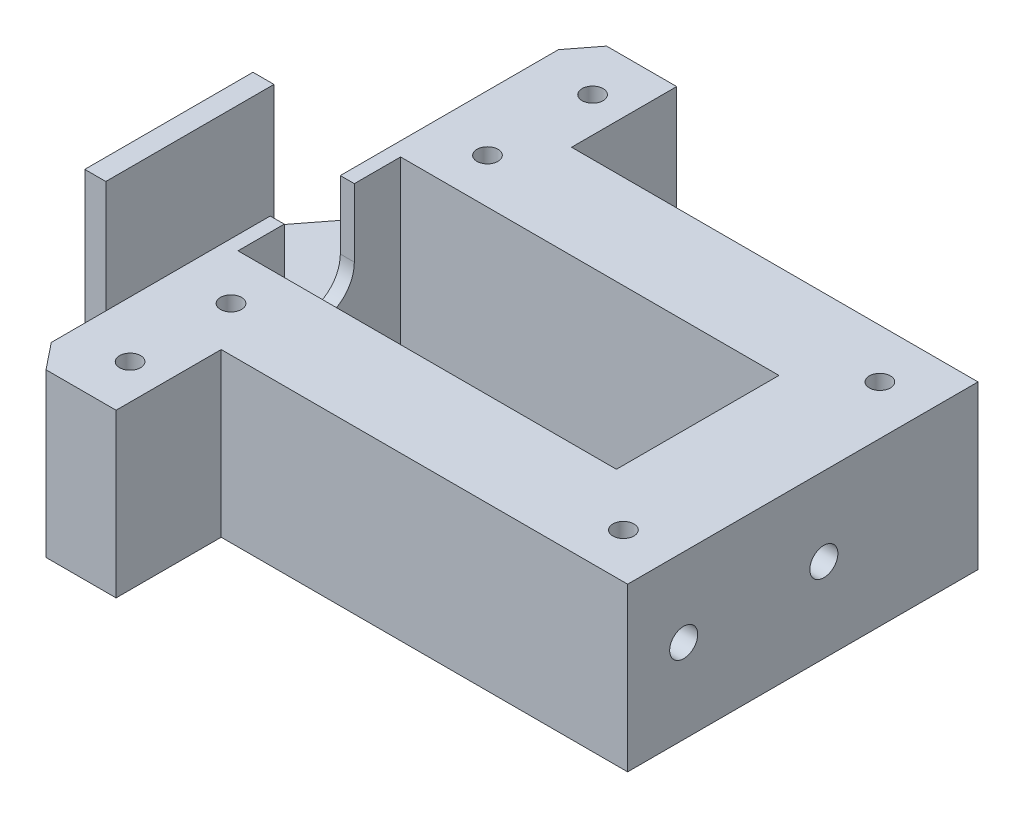
ISO-10303-21;
HEADER;
FILE_DESCRIPTION(('STEP AP214'),'2;1');
FILE_NAME('part.step','',(''),(''),'','','');
FILE_SCHEMA(('AUTOMOTIVE_DESIGN { 1 0 10303 214 1 1 1 1 }'));
ENDSEC;
DATA;
#1=APPLICATION_CONTEXT('core data for automotive mechanical design processes');
#2=APPLICATION_PROTOCOL_DEFINITION('international standard','automotive_design',2000,#1);
#3=PRODUCT_CONTEXT('',#1,'mechanical');
#4=PRODUCT('Part','Part','',(#3));
#5=PRODUCT_RELATED_PRODUCT_CATEGORY('part','',(#4));
#6=PRODUCT_DEFINITION_FORMATION('','',#4);
#7=PRODUCT_DEFINITION_CONTEXT('part definition',#1,'design');
#8=PRODUCT_DEFINITION('design','',#6,#7);
#9=PRODUCT_DEFINITION_SHAPE('','',#8);
#10=(LENGTH_UNIT() NAMED_UNIT(*) SI_UNIT(.MILLI.,.METRE.));
#11=(NAMED_UNIT(*) PLANE_ANGLE_UNIT() SI_UNIT($,.RADIAN.));
#12=(NAMED_UNIT(*) SI_UNIT($,.STERADIAN.) SOLID_ANGLE_UNIT());
#13=UNCERTAINTY_MEASURE_WITH_UNIT(LENGTH_MEASURE(1.E-05),#10,'distance_accuracy_value','');
#14=(GEOMETRIC_REPRESENTATION_CONTEXT(3) GLOBAL_UNCERTAINTY_ASSIGNED_CONTEXT((#13)) GLOBAL_UNIT_ASSIGNED_CONTEXT((#10,
#11,#12)) REPRESENTATION_CONTEXT('',''));
#15=CARTESIAN_POINT('',(0.,0.,0.));
#16=DIRECTION('',(0.,0.,1.));
#17=DIRECTION('',(1.,0.,0.));
#18=AXIS2_PLACEMENT_3D('',#15,#16,#17);
#19=CARTESIAN_POINT('',(0.,11.6,6.23298171670485));
#20=DIRECTION('',(0.781245544254896,0.,-0.624223837723193));
#21=DIRECTION('',(-0.624223837723193,0.,-0.781245544254896));
#22=AXIS2_PLACEMENT_3D('',#19,#20,#21);
#23=PLANE('',#22);
#24=DIRECTION('',(0.624223837723193,0.,0.781245544254896));
#25=VECTOR('',#24,1.);
#26=CARTESIAN_POINT('',(1.5,2.05,8.11030239169965));
#27=LINE('',#26,#25);
#28=CARTESIAN_POINT('',(0.,2.05,6.23298171670485));
#29=VERTEX_POINT('',#28);
#30=CARTESIAN_POINT('',(9.5,2.05,18.1226793250052));
#31=VERTEX_POINT('',#30);
#32=EDGE_CURVE('E274',#29,#31,#27,.T.);
#33=ORIENTED_EDGE('',*,*,#32,.F.);
#34=DIRECTION('',(0.,-1.,0.));
#35=VECTOR('',#34,1.);
#36=CARTESIAN_POINT('',(0.,11.6,6.23298171670485));
#37=LINE('',#36,#35);
#38=CARTESIAN_POINT('',(0.,0.,6.23298171670485));
#39=VERTEX_POINT('',#38);
#40=EDGE_CURVE('E223',#29,#39,#37,.T.);
#41=ORIENTED_EDGE('',*,*,#40,.T.);
#42=DIRECTION('',(0.624223837723193,0.,0.781245544254896));
#43=VECTOR('',#42,1.);
#44=CARTESIAN_POINT('',(0.,0.,6.23298171670485));
#45=LINE('',#44,#43);
#46=CARTESIAN_POINT('',(11.,0.,20.));
#47=VERTEX_POINT('',#46);
#48=EDGE_CURVE('E224',#39,#47,#45,.T.);
#49=ORIENTED_EDGE('',*,*,#48,.T.);
#50=DIRECTION('',(0.,-1.,0.));
#51=VECTOR('',#50,1.);
#52=CARTESIAN_POINT('',(11.,11.6,20.));
#53=LINE('',#52,#51);
#54=CARTESIAN_POINT('',(11.,11.6,20.));
#55=VERTEX_POINT('',#54);
#56=EDGE_CURVE('E11',#55,#47,#53,.T.);
#57=ORIENTED_EDGE('',*,*,#56,.F.);
#58=DIRECTION('',(0.624223837723193,0.,0.781245544254896));
#59=VECTOR('',#58,1.);
#60=CARTESIAN_POINT('',(0.,11.6,6.23298171670485));
#61=LINE('',#60,#59);
#62=CARTESIAN_POINT('',(9.5,11.6,18.1226793250052));
#63=VERTEX_POINT('',#62);
#64=EDGE_CURVE('E242',#63,#55,#61,.T.);
#65=ORIENTED_EDGE('',*,*,#64,.F.);
#66=DIRECTION('',(0.,1.,0.));
#67=VECTOR('',#66,1.);
#68=CARTESIAN_POINT('',(9.5,2.05,18.1226793250052));
#69=LINE('',#68,#67);
#70=EDGE_CURVE('E286',#31,#63,#69,.T.);
#71=ORIENTED_EDGE('',*,*,#70,.F.);
#72=EDGE_LOOP('',(#33,#41,#49,#57,#65,#71));
#73=FACE_BOUND('',#72,.T.);
#74=ADVANCED_FACE('F34',(#73),#23,.F.);
#75=CARTESIAN_POINT('',(11.,11.6,-20.));
#76=DIRECTION('',(0.791236938020187,0.,0.611509695681466));
#77=DIRECTION('',(0.611509695681466,0.,-0.791236938020187));
#78=AXIS2_PLACEMENT_3D('',#75,#76,#77);
#79=PLANE('',#78);
#80=DIRECTION('',(0.,-1.,0.));
#81=VECTOR('',#80,1.);
#82=CARTESIAN_POINT('',(0.,11.6,-5.76701828329514));
#83=LINE('',#82,#81);
#84=CARTESIAN_POINT('',(0.,2.05,-5.76701828329514));
#85=VERTEX_POINT('',#84);
#86=CARTESIAN_POINT('',(0.,0.,-5.76701828329514));
#87=VERTEX_POINT('',#86);
#88=EDGE_CURVE('E246',#85,#87,#83,.T.);
#89=ORIENTED_EDGE('',*,*,#88,.F.);
#90=DIRECTION('',(-0.611509695681466,0.,0.791236938020187));
#91=VECTOR('',#90,1.);
#92=CARTESIAN_POINT('',(9.5,2.05,-18.059138856813));
#93=LINE('',#92,#91);
#94=CARTESIAN_POINT('',(9.5,2.05,-18.059138856813));
#95=VERTEX_POINT('',#94);
#96=EDGE_CURVE('E265',#95,#85,#93,.T.);
#97=ORIENTED_EDGE('',*,*,#96,.F.);
#98=DIRECTION('',(0.,1.,0.));
#99=VECTOR('',#98,1.);
#100=CARTESIAN_POINT('',(9.5,2.05,-18.059138856813));
#101=LINE('',#100,#99);
#102=CARTESIAN_POINT('',(9.5,11.6,-18.059138856813));
#103=VERTEX_POINT('',#102);
#104=EDGE_CURVE('E228',#95,#103,#101,.T.);
#105=ORIENTED_EDGE('',*,*,#104,.T.);
#106=DIRECTION('',(-0.611509695681466,0.,0.791236938020187));
#107=VECTOR('',#106,1.);
#108=CARTESIAN_POINT('',(11.,11.6,-20.));
#109=LINE('',#108,#107);
#110=CARTESIAN_POINT('',(11.,11.6,-20.));
#111=VERTEX_POINT('',#110);
#112=EDGE_CURVE('E212',#111,#103,#109,.T.);
#113=ORIENTED_EDGE('',*,*,#112,.F.);
#114=DIRECTION('',(0.,-1.,0.));
#115=VECTOR('',#114,1.);
#116=CARTESIAN_POINT('',(11.,11.6,-20.));
#117=LINE('',#116,#115);
#118=CARTESIAN_POINT('',(11.,0.,-20.));
#119=VERTEX_POINT('',#118);
#120=EDGE_CURVE('E41',#111,#119,#117,.T.);
#121=ORIENTED_EDGE('',*,*,#120,.T.);
#122=DIRECTION('',(-0.611509695681466,0.,0.791236938020187));
#123=VECTOR('',#122,1.);
#124=CARTESIAN_POINT('',(11.,0.,-20.));
#125=LINE('',#124,#123);
#126=EDGE_CURVE('E236',#119,#87,#125,.T.);
#127=ORIENTED_EDGE('',*,*,#126,.T.);
#128=EDGE_LOOP('',(#89,#97,#105,#113,#121,#127));
#129=FACE_BOUND('',#128,.T.);
#130=ADVANCED_FACE('F252',(#129),#79,.F.);
#131=CARTESIAN_POINT('',(0.,11.6,0.));
#132=DIRECTION('',(0.,-1.,0.));
#133=DIRECTION('',(0.,0.,-1.));
#134=AXIS2_PLACEMENT_3D('',#131,#132,#133);
#135=PLANE('',#134);
#136=CARTESIAN_POINT('',(13.5,11.6,-9.));
#137=DIRECTION('',(0.,1.,0.));
#138=DIRECTION('',(0.,0.,1.));
#139=AXIS2_PLACEMENT_3D('',#136,#137,#138);
#140=CIRCLE('',#139,0.75);
#141=CARTESIAN_POINT('',(13.5,11.6,-8.25));
#142=VERTEX_POINT('',#141);
#143=EDGE_CURVE('E826',#142,#142,#140,.T.);
#144=ORIENTED_EDGE('',*,*,#143,.F.);
#145=EDGE_LOOP('',(#144));
#146=FACE_BOUND('',#145,.T.);
#147=CARTESIAN_POINT('',(41.5,11.6,-9.));
#148=DIRECTION('',(0.,1.,0.));
#149=DIRECTION('',(0.,0.,1.));
#150=AXIS2_PLACEMENT_3D('',#147,#148,#149);
#151=CIRCLE('',#150,0.749999999999999);
#152=CARTESIAN_POINT('',(41.5,11.6,-8.25));
#153=VERTEX_POINT('',#152);
#154=EDGE_CURVE('E832',#153,#153,#151,.T.);
#155=ORIENTED_EDGE('',*,*,#154,.F.);
#156=EDGE_LOOP('',(#155));
#157=FACE_BOUND('',#156,.T.);
#158=CARTESIAN_POINT('',(41.5,11.6,9.3));
#159=DIRECTION('',(0.,1.,0.));
#160=DIRECTION('',(0.,0.,1.));
#161=AXIS2_PLACEMENT_3D('',#158,#159,#160);
#162=CIRCLE('',#161,0.749999999999999);
#163=CARTESIAN_POINT('',(41.5,11.6,10.05));
#164=VERTEX_POINT('',#163);
#165=EDGE_CURVE('E838',#164,#164,#162,.T.);
#166=ORIENTED_EDGE('',*,*,#165,.F.);
#167=EDGE_LOOP('',(#166));
#168=FACE_BOUND('',#167,.T.);
#169=CARTESIAN_POINT('',(13.5,11.6,9.3));
#170=DIRECTION('',(0.,1.,0.));
#171=DIRECTION('',(0.,0.,1.));
#172=AXIS2_PLACEMENT_3D('',#169,#170,#171);
#173=CIRCLE('',#172,0.75);
#174=CARTESIAN_POINT('',(13.5,11.6,10.05));
#175=VERTEX_POINT('',#174);
#176=EDGE_CURVE('E844',#175,#175,#173,.T.);
#177=ORIENTED_EDGE('',*,*,#176,.F.);
#178=EDGE_LOOP('',(#177));
#179=FACE_BOUND('',#178,.T.);
#180=CARTESIAN_POINT('',(13.5,11.6,16.5));
#181=DIRECTION('',(0.,1.,0.));
#182=DIRECTION('',(0.,0.,1.));
#183=AXIS2_PLACEMENT_3D('',#180,#181,#182);
#184=CIRCLE('',#183,0.75);
#185=CARTESIAN_POINT('',(13.5,11.6,17.25));
#186=VERTEX_POINT('',#185);
#187=EDGE_CURVE('E820',#186,#186,#184,.T.);
#188=ORIENTED_EDGE('',*,*,#187,.F.);
#189=EDGE_LOOP('',(#188));
#190=FACE_BOUND('',#189,.T.);
#191=CARTESIAN_POINT('',(13.5,11.6,-16.5));
#192=DIRECTION('',(0.,1.,0.));
#193=DIRECTION('',(0.,0.,1.));
#194=AXIS2_PLACEMENT_3D('',#191,#192,#193);
#195=CIRCLE('',#194,0.75);
#196=CARTESIAN_POINT('',(13.5,11.6,-15.75));
#197=VERTEX_POINT('',#196);
#198=EDGE_CURVE('E825',#197,#197,#195,.T.);
#199=ORIENTED_EDGE('',*,*,#198,.F.);
#200=EDGE_LOOP('',(#199));
#201=FACE_BOUND('',#200,.T.);
#202=DIRECTION('',(-1.,0.,0.));
#203=VECTOR('',#202,1.);
#204=CARTESIAN_POINT('',(16.,11.6,-12.5));
#205=LINE('',#204,#203);
#206=CARTESIAN_POINT('',(45.,11.6,-12.5));
#207=VERTEX_POINT('',#206);
#208=CARTESIAN_POINT('',(16.,11.6,-12.5));
#209=VERTEX_POINT('',#208);
#210=EDGE_CURVE('E199',#207,#209,#205,.T.);
#211=ORIENTED_EDGE('',*,*,#210,.T.);
#212=DIRECTION('',(0.,0.,-1.));
#213=VECTOR('',#212,1.);
#214=CARTESIAN_POINT('',(16.,11.6,-20.));
#215=LINE('',#214,#213);
#216=CARTESIAN_POINT('',(16.,11.6,-20.));
#217=VERTEX_POINT('',#216);
#218=EDGE_CURVE('E192',#209,#217,#215,.T.);
#219=ORIENTED_EDGE('',*,*,#218,.T.);
#220=DIRECTION('',(-1.,0.,0.));
#221=VECTOR('',#220,1.);
#222=CARTESIAN_POINT('',(45.,11.6,-20.));
#223=LINE('',#222,#221);
#224=EDGE_CURVE('E204',#217,#111,#223,.T.);
#225=ORIENTED_EDGE('',*,*,#224,.T.);
#226=ORIENTED_EDGE('',*,*,#112,.T.);
#227=DIRECTION('',(0.,0.,-1.));
#228=VECTOR('',#227,1.);
#229=CARTESIAN_POINT('',(9.5,11.6,18.1226793250052));
#230=LINE('',#229,#228);
#231=CARTESIAN_POINT('',(9.5,11.6,-2.5));
#232=VERTEX_POINT('',#231);
#233=EDGE_CURVE('E277',#232,#103,#230,.T.);
#234=ORIENTED_EDGE('',*,*,#233,.F.);
#235=DIRECTION('',(1.,0.,0.));
#236=VECTOR('',#235,1.);
#237=CARTESIAN_POINT('',(7.5,11.6,-2.5));
#238=LINE('',#237,#236);
#239=CARTESIAN_POINT('',(10.5,11.6,-2.5));
#240=VERTEX_POINT('',#239);
#241=EDGE_CURVE('E344',#232,#240,#238,.T.);
#242=ORIENTED_EDGE('',*,*,#241,.T.);
#243=DIRECTION('',(0.,0.,1.));
#244=VECTOR('',#243,1.);
#245=CARTESIAN_POINT('',(10.5,11.6,-5.8));
#246=LINE('',#245,#244);
#247=CARTESIAN_POINT('',(10.5,11.6,-5.8));
#248=VERTEX_POINT('',#247);
#249=EDGE_CURVE('E373',#248,#240,#246,.T.);
#250=ORIENTED_EDGE('',*,*,#249,.F.);
#251=DIRECTION('',(-1.,0.,0.));
#252=VECTOR('',#251,1.);
#253=CARTESIAN_POINT('',(10.5,11.6,-5.8));
#254=LINE('',#253,#252);
#255=CARTESIAN_POINT('',(37.5,11.6,-5.8));
#256=VERTEX_POINT('',#255);
#257=EDGE_CURVE('E364',#256,#248,#254,.T.);
#258=ORIENTED_EDGE('',*,*,#257,.F.);
#259=DIRECTION('',(0.,0.,-1.));
#260=VECTOR('',#259,1.);
#261=CARTESIAN_POINT('',(37.5,11.6,-5.8));
#262=LINE('',#261,#260);
#263=CARTESIAN_POINT('',(37.5,11.6,5.8));
#264=VERTEX_POINT('',#263);
#265=EDGE_CURVE('E379',#264,#256,#262,.T.);
#266=ORIENTED_EDGE('',*,*,#265,.F.);
#267=DIRECTION('',(1.,0.,0.));
#268=VECTOR('',#267,1.);
#269=CARTESIAN_POINT('',(10.5,11.6,5.8));
#270=LINE('',#269,#268);
#271=CARTESIAN_POINT('',(10.5,11.6,5.8));
#272=VERTEX_POINT('',#271);
#273=EDGE_CURVE('E376',#272,#264,#270,.T.);
#274=ORIENTED_EDGE('',*,*,#273,.F.);
#275=CARTESIAN_POINT('',(10.5,11.6,2.5));
#276=VERTEX_POINT('',#275);
#277=EDGE_CURVE('E359',#276,#272,#246,.T.);
#278=ORIENTED_EDGE('',*,*,#277,.F.);
#279=DIRECTION('',(1.,0.,0.));
#280=VECTOR('',#279,1.);
#281=CARTESIAN_POINT('',(7.5,11.6,2.5));
#282=LINE('',#281,#280);
#283=CARTESIAN_POINT('',(9.5,11.6,2.5));
#284=VERTEX_POINT('',#283);
#285=EDGE_CURVE('E341',#284,#276,#282,.T.);
#286=ORIENTED_EDGE('',*,*,#285,.F.);
#287=EDGE_CURVE('E271',#63,#284,#230,.T.);
#288=ORIENTED_EDGE('',*,*,#287,.F.);
#289=ORIENTED_EDGE('',*,*,#64,.T.);
#290=DIRECTION('',(1.,0.,0.));
#291=VECTOR('',#290,1.);
#292=CARTESIAN_POINT('',(11.,11.6,20.));
#293=LINE('',#292,#291);
#294=CARTESIAN_POINT('',(16.,11.6,20.));
#295=VERTEX_POINT('',#294);
#296=EDGE_CURVE('E217',#55,#295,#293,.T.);
#297=ORIENTED_EDGE('',*,*,#296,.T.);
#298=DIRECTION('',(0.,0.,-1.));
#299=VECTOR('',#298,1.);
#300=CARTESIAN_POINT('',(16.,11.6,20.));
#301=LINE('',#300,#299);
#302=CARTESIAN_POINT('',(16.,11.6,12.5));
#303=VERTEX_POINT('',#302);
#304=EDGE_CURVE('E297',#295,#303,#301,.T.);
#305=ORIENTED_EDGE('',*,*,#304,.T.);
#306=DIRECTION('',(1.,0.,0.));
#307=VECTOR('',#306,1.);
#308=CARTESIAN_POINT('',(16.,11.6,12.5));
#309=LINE('',#308,#307);
#310=CARTESIAN_POINT('',(45.,11.6,12.5));
#311=VERTEX_POINT('',#310);
#312=EDGE_CURVE('E864',#303,#311,#309,.T.);
#313=ORIENTED_EDGE('',*,*,#312,.T.);
#314=DIRECTION('',(0.,0.,-1.));
#315=VECTOR('',#314,1.);
#316=CARTESIAN_POINT('',(45.,11.6,20.));
#317=LINE('',#316,#315);
#318=EDGE_CURVE('E213',#311,#207,#317,.T.);
#319=ORIENTED_EDGE('',*,*,#318,.T.);
#320=EDGE_LOOP('',(#211,#219,#225,#226,#234,#242,#250,#258,#266,#274,#278,#286,#288,#289,#297,
#305,#313,#319));
#321=FACE_BOUND('',#320,.T.);
#322=ADVANCED_FACE('F202',(#146,#157,#168,#179,#190,#201,#321),#135,.F.);
#323=CARTESIAN_POINT('',(11.,11.6,20.));
#324=DIRECTION('',(0.,0.,-1.));
#325=DIRECTION('',(-1.,0.,0.));
#326=AXIS2_PLACEMENT_3D('',#323,#324,#325);
#327=PLANE('',#326);
#328=DIRECTION('',(1.,0.,0.));
#329=VECTOR('',#328,1.);
#330=CARTESIAN_POINT('',(11.,0.,20.));
#331=LINE('',#330,#329);
#332=CARTESIAN_POINT('',(16.,0.,20.));
#333=VERTEX_POINT('',#332);
#334=EDGE_CURVE('E227',#47,#333,#331,.T.);
#335=ORIENTED_EDGE('',*,*,#334,.T.);
#336=DIRECTION('',(0.,-1.,0.));
#337=VECTOR('',#336,1.);
#338=CARTESIAN_POINT('',(16.,11.6,20.));
#339=LINE('',#338,#337);
#340=EDGE_CURVE('E304',#295,#333,#339,.T.);
#341=ORIENTED_EDGE('',*,*,#340,.F.);
#342=ORIENTED_EDGE('',*,*,#296,.F.);
#343=ORIENTED_EDGE('',*,*,#56,.T.);
#344=EDGE_LOOP('',(#335,#341,#342,#343));
#345=FACE_BOUND('',#344,.T.);
#346=ADVANCED_FACE('F303',(#345),#327,.F.);
#347=CARTESIAN_POINT('',(45.,11.6,20.));
#348=DIRECTION('',(-1.,0.,0.));
#349=DIRECTION('',(0.,0.,1.));
#350=AXIS2_PLACEMENT_3D('',#347,#348,#349);
#351=PLANE('',#350);
#352=CARTESIAN_POINT('',(45.,6.,-1.5));
#353=DIRECTION('',(1.,0.,0.));
#354=DIRECTION('',(0.,0.,-1.));
#355=AXIS2_PLACEMENT_3D('',#352,#353,#354);
#356=CIRCLE('',#355,1.);
#357=CARTESIAN_POINT('',(45.,6.,-2.5));
#358=VERTEX_POINT('',#357);
#359=EDGE_CURVE('E811',#358,#358,#356,.T.);
#360=ORIENTED_EDGE('',*,*,#359,.F.);
#361=EDGE_LOOP('',(#360));
#362=FACE_BOUND('',#361,.T.);
#363=CARTESIAN_POINT('',(45.,6.,8.5));
#364=DIRECTION('',(1.,0.,0.));
#365=DIRECTION('',(0.,0.,-1.));
#366=AXIS2_PLACEMENT_3D('',#363,#364,#365);
#367=CIRCLE('',#366,1.);
#368=CARTESIAN_POINT('',(45.,6.,7.5));
#369=VERTEX_POINT('',#368);
#370=EDGE_CURVE('E810',#369,#369,#367,.T.);
#371=ORIENTED_EDGE('',*,*,#370,.F.);
#372=EDGE_LOOP('',(#371));
#373=FACE_BOUND('',#372,.T.);
#374=DIRECTION('',(0.,0.,-1.));
#375=VECTOR('',#374,1.);
#376=CARTESIAN_POINT('',(45.,0.,20.));
#377=LINE('',#376,#375);
#378=CARTESIAN_POINT('',(45.,0.,12.5));
#379=VERTEX_POINT('',#378);
#380=CARTESIAN_POINT('',(45.,0.,-12.5));
#381=VERTEX_POINT('',#380);
#382=EDGE_CURVE('E231',#379,#381,#377,.T.);
#383=ORIENTED_EDGE('',*,*,#382,.T.);
#384=DIRECTION('',(0.,-1.,0.));
#385=VECTOR('',#384,1.);
#386=CARTESIAN_POINT('',(45.,11.6,-12.5));
#387=LINE('',#386,#385);
#388=EDGE_CURVE('E48',#207,#381,#387,.T.);
#389=ORIENTED_EDGE('',*,*,#388,.F.);
#390=ORIENTED_EDGE('',*,*,#318,.F.);
#391=DIRECTION('',(0.,-1.,0.));
#392=VECTOR('',#391,1.);
#393=CARTESIAN_POINT('',(45.,11.6,12.5));
#394=LINE('',#393,#392);
#395=EDGE_CURVE('E872',#311,#379,#394,.T.);
#396=ORIENTED_EDGE('',*,*,#395,.T.);
#397=EDGE_LOOP('',(#383,#389,#390,#396));
#398=FACE_BOUND('',#397,.T.);
#399=ADVANCED_FACE('F446',(#362,#373,#398),#351,.F.);
#400=CARTESIAN_POINT('',(45.,11.6,-20.));
#401=DIRECTION('',(0.,0.,1.));
#402=DIRECTION('',(1.,0.,0.));
#403=AXIS2_PLACEMENT_3D('',#400,#401,#402);
#404=PLANE('',#403);
#405=ORIENTED_EDGE('',*,*,#224,.F.);
#406=DIRECTION('',(0.,-1.,0.));
#407=VECTOR('',#406,1.);
#408=CARTESIAN_POINT('',(16.,11.6,-20.));
#409=LINE('',#408,#407);
#410=CARTESIAN_POINT('',(16.,0.,-20.));
#411=VERTEX_POINT('',#410);
#412=EDGE_CURVE('E189',#217,#411,#409,.T.);
#413=ORIENTED_EDGE('',*,*,#412,.T.);
#414=DIRECTION('',(-1.,0.,0.));
#415=VECTOR('',#414,1.);
#416=CARTESIAN_POINT('',(45.,0.,-20.));
#417=LINE('',#416,#415);
#418=EDGE_CURVE('E234',#411,#119,#417,.T.);
#419=ORIENTED_EDGE('',*,*,#418,.T.);
#420=ORIENTED_EDGE('',*,*,#120,.F.);
#421=EDGE_LOOP('',(#405,#413,#419,#420));
#422=FACE_BOUND('',#421,.T.);
#423=ADVANCED_FACE('F209',(#422),#404,.F.);
#424=CARTESIAN_POINT('',(0.,11.6,-5.76701828329514));
#425=DIRECTION('',(1.,0.,0.));
#426=DIRECTION('',(0.,0.,-1.));
#427=AXIS2_PLACEMENT_3D('',#424,#425,#426);
#428=PLANE('',#427);
#429=DIRECTION('',(0.,0.,1.));
#430=VECTOR('',#429,1.);
#431=CARTESIAN_POINT('',(0.,0.,-5.76701828329514));
#432=LINE('',#431,#430);
#433=EDGE_CURVE('E239',#87,#39,#432,.T.);
#434=ORIENTED_EDGE('',*,*,#433,.T.);
#435=ORIENTED_EDGE('',*,*,#40,.F.);
#436=CARTESIAN_POINT('',(0.,11.6,6.23298171670485));
#437=VERTEX_POINT('',#436);
#438=EDGE_CURVE('E243',#437,#29,#37,.T.);
#439=ORIENTED_EDGE('',*,*,#438,.F.);
#440=DIRECTION('',(0.,0.,1.));
#441=VECTOR('',#440,1.);
#442=CARTESIAN_POINT('',(0.,11.6,-5.76701828329514));
#443=LINE('',#442,#441);
#444=CARTESIAN_POINT('',(0.,11.6,-5.76701828329514));
#445=VERTEX_POINT('',#444);
#446=EDGE_CURVE('E215',#445,#437,#443,.T.);
#447=ORIENTED_EDGE('',*,*,#446,.F.);
#448=EDGE_CURVE('E247',#445,#85,#83,.T.);
#449=ORIENTED_EDGE('',*,*,#448,.T.);
#450=ORIENTED_EDGE('',*,*,#88,.T.);
#451=EDGE_LOOP('',(#434,#435,#439,#447,#449,#450));
#452=FACE_BOUND('',#451,.T.);
#453=ADVANCED_FACE('F261',(#452),#428,.F.);
#454=ORIENTED_EDGE('',*,*,#446,.T.);
#455=DIRECTION('',(-1.,0.,0.));
#456=VECTOR('',#455,1.);
#457=CARTESIAN_POINT('',(0.,11.6,6.23298171670485));
#458=LINE('',#457,#456);
#459=CARTESIAN_POINT('',(1.5,11.6,6.23298171670486));
#460=VERTEX_POINT('',#459);
#461=EDGE_CURVE('E319',#460,#437,#458,.T.);
#462=ORIENTED_EDGE('',*,*,#461,.F.);
#463=DIRECTION('',(0.,0.,1.));
#464=VECTOR('',#463,1.);
#465=CARTESIAN_POINT('',(1.5,11.6,-7.70787942648217));
#466=LINE('',#465,#464);
#467=CARTESIAN_POINT('',(1.5,11.6,-5.76701828329514));
#468=VERTEX_POINT('',#467);
#469=EDGE_CURVE('E287',#468,#460,#466,.T.);
#470=ORIENTED_EDGE('',*,*,#469,.F.);
#471=DIRECTION('',(1.,0.,0.));
#472=VECTOR('',#471,1.);
#473=CARTESIAN_POINT('',(0.,11.6,-5.76701828329514));
#474=LINE('',#473,#472);
#475=EDGE_CURVE('E314',#445,#468,#474,.T.);
#476=ORIENTED_EDGE('',*,*,#475,.F.);
#477=EDGE_LOOP('',(#454,#462,#470,#476));
#478=FACE_BOUND('',#477,.T.);
#479=ADVANCED_FACE('F322',(#478),#135,.F.);
#480=CARTESIAN_POINT('',(0.,0.,0.));
#481=DIRECTION('',(0.,-1.,0.));
#482=DIRECTION('',(0.,0.,-1.));
#483=AXIS2_PLACEMENT_3D('',#480,#481,#482);
#484=PLANE('',#483);
#485=DIRECTION('',(0.,0.,-1.));
#486=VECTOR('',#485,1.);
#487=CARTESIAN_POINT('',(16.,0.,-20.));
#488=LINE('',#487,#486);
#489=CARTESIAN_POINT('',(16.,0.,-12.5));
#490=VERTEX_POINT('',#489);
#491=EDGE_CURVE('E195',#490,#411,#488,.T.);
#492=ORIENTED_EDGE('',*,*,#491,.F.);
#493=DIRECTION('',(-1.,0.,0.));
#494=VECTOR('',#493,1.);
#495=CARTESIAN_POINT('',(16.,0.,-12.5));
#496=LINE('',#495,#494);
#497=EDGE_CURVE('E207',#381,#490,#496,.T.);
#498=ORIENTED_EDGE('',*,*,#497,.F.);
#499=ORIENTED_EDGE('',*,*,#382,.F.);
#500=DIRECTION('',(1.,0.,0.));
#501=VECTOR('',#500,1.);
#502=CARTESIAN_POINT('',(16.,0.,12.5));
#503=LINE('',#502,#501);
#504=CARTESIAN_POINT('',(16.,0.,12.5));
#505=VERTEX_POINT('',#504);
#506=EDGE_CURVE('E865',#505,#379,#503,.T.);
#507=ORIENTED_EDGE('',*,*,#506,.F.);
#508=DIRECTION('',(0.,0.,-1.));
#509=VECTOR('',#508,1.);
#510=CARTESIAN_POINT('',(16.,0.,20.));
#511=LINE('',#510,#509);
#512=EDGE_CURVE('E56',#333,#505,#511,.T.);
#513=ORIENTED_EDGE('',*,*,#512,.F.);
#514=ORIENTED_EDGE('',*,*,#334,.F.);
#515=ORIENTED_EDGE('',*,*,#48,.F.);
#516=ORIENTED_EDGE('',*,*,#433,.F.);
#517=ORIENTED_EDGE('',*,*,#126,.F.);
#518=ORIENTED_EDGE('',*,*,#418,.F.);
#519=EDGE_LOOP('',(#492,#498,#499,#507,#513,#514,#515,#516,#517,#518));
#520=FACE_BOUND('',#519,.T.);
#521=CARTESIAN_POINT('',(30.5,0.,-9.89));
#522=DIRECTION('',(0.,-1.,0.));
#523=DIRECTION('',(0.,0.,-1.));
#524=AXIS2_PLACEMENT_3D('',#521,#522,#523);
#525=CIRCLE('',#524,1.25999999999999);
#526=CARTESIAN_POINT('',(30.5,0.,-11.15));
#527=VERTEX_POINT('',#526);
#528=EDGE_CURVE('E871',#527,#527,#525,.T.);
#529=ORIENTED_EDGE('',*,*,#528,.F.);
#530=EDGE_LOOP('',(#529));
#531=FACE_BOUND('',#530,.T.);
#532=CARTESIAN_POINT('',(30.5,0.,9.89));
#533=DIRECTION('',(0.,-1.,0.));
#534=DIRECTION('',(0.,0.,-1.));
#535=AXIS2_PLACEMENT_3D('',#532,#533,#534);
#536=CIRCLE('',#535,1.25999999999999);
#537=CARTESIAN_POINT('',(30.5,0.,8.63000000000001));
#538=VERTEX_POINT('',#537);
#539=EDGE_CURVE('E879',#538,#538,#536,.T.);
#540=ORIENTED_EDGE('',*,*,#539,.F.);
#541=EDGE_LOOP('',(#540));
#542=FACE_BOUND('',#541,.T.);
#543=DIRECTION('',(0.,0.,1.));
#544=VECTOR('',#543,1.);
#545=CARTESIAN_POINT('',(10.5,0.,-5.8));
#546=LINE('',#545,#544);
#547=CARTESIAN_POINT('',(10.5,0.,-5.8));
#548=VERTEX_POINT('',#547);
#549=CARTESIAN_POINT('',(10.5,0.,5.8));
#550=VERTEX_POINT('',#549);
#551=EDGE_CURVE('E360',#548,#550,#546,.T.);
#552=ORIENTED_EDGE('',*,*,#551,.T.);
#553=DIRECTION('',(1.,0.,0.));
#554=VECTOR('',#553,1.);
#555=CARTESIAN_POINT('',(10.5,0.,5.8));
#556=LINE('',#555,#554);
#557=CARTESIAN_POINT('',(37.5,0.,5.8));
#558=VERTEX_POINT('',#557);
#559=EDGE_CURVE('E363',#550,#558,#556,.T.);
#560=ORIENTED_EDGE('',*,*,#559,.T.);
#561=DIRECTION('',(0.,0.,-1.));
#562=VECTOR('',#561,1.);
#563=CARTESIAN_POINT('',(37.5,0.,-5.8));
#564=LINE('',#563,#562);
#565=CARTESIAN_POINT('',(37.5,0.,-5.8));
#566=VERTEX_POINT('',#565);
#567=EDGE_CURVE('E367',#558,#566,#564,.T.);
#568=ORIENTED_EDGE('',*,*,#567,.T.);
#569=DIRECTION('',(-1.,0.,0.));
#570=VECTOR('',#569,1.);
#571=CARTESIAN_POINT('',(10.5,0.,-5.8));
#572=LINE('',#571,#570);
#573=EDGE_CURVE('E370',#566,#548,#572,.T.);
#574=ORIENTED_EDGE('',*,*,#573,.T.);
#575=EDGE_LOOP('',(#552,#560,#568,#574));
#576=FACE_BOUND('',#575,.T.);
#577=ADVANCED_FACE('F256',(#520,#531,#542,#576),#484,.T.);
#578=CARTESIAN_POINT('',(9.5,2.05,18.1226793250052));
#579=DIRECTION('',(1.,0.,0.));
#580=DIRECTION('',(0.,0.,-1.));
#581=AXIS2_PLACEMENT_3D('',#578,#579,#580);
#582=PLANE('',#581);
#583=ORIENTED_EDGE('',*,*,#287,.T.);
#584=DIRECTION('',(0.,-1.,0.));
#585=VECTOR('',#584,1.);
#586=CARTESIAN_POINT('',(9.5,2.05,2.5));
#587=LINE('',#586,#585);
#588=CARTESIAN_POINT('',(9.5,6.75,2.5));
#589=VERTEX_POINT('',#588);
#590=EDGE_CURVE('E356',#284,#589,#587,.T.);
#591=ORIENTED_EDGE('',*,*,#590,.T.);
#592=CARTESIAN_POINT('',(9.5,6.75,0.));
#593=DIRECTION('',(1.,0.,0.));
#594=DIRECTION('',(0.,0.,-1.));
#595=AXIS2_PLACEMENT_3D('',#592,#593,#594);
#596=CIRCLE('',#595,2.5);
#597=CARTESIAN_POINT('',(9.5,6.75,-2.5));
#598=VERTEX_POINT('',#597);
#599=EDGE_CURVE('E343',#589,#598,#596,.T.);
#600=ORIENTED_EDGE('',*,*,#599,.T.);
#601=DIRECTION('',(0.,1.,0.));
#602=VECTOR('',#601,1.);
#603=CARTESIAN_POINT('',(9.5,2.05,-2.5));
#604=LINE('',#603,#602);
#605=EDGE_CURVE('E353',#598,#232,#604,.T.);
#606=ORIENTED_EDGE('',*,*,#605,.T.);
#607=ORIENTED_EDGE('',*,*,#233,.T.);
#608=ORIENTED_EDGE('',*,*,#104,.F.);
#609=DIRECTION('',(0.,0.,-1.));
#610=VECTOR('',#609,1.);
#611=CARTESIAN_POINT('',(9.5,2.05,18.1226793250052));
#612=LINE('',#611,#610);
#613=EDGE_CURVE('E284',#31,#95,#612,.T.);
#614=ORIENTED_EDGE('',*,*,#613,.F.);
#615=ORIENTED_EDGE('',*,*,#70,.T.);
#616=EDGE_LOOP('',(#583,#591,#600,#606,#607,#608,#614,#615));
#617=FACE_BOUND('',#616,.T.);
#618=ADVANCED_FACE('F414',(#617),#582,.F.);
#619=CARTESIAN_POINT('',(1.5,2.05,-7.70787942648217));
#620=DIRECTION('',(-1.,0.,0.));
#621=DIRECTION('',(0.,0.,1.));
#622=AXIS2_PLACEMENT_3D('',#619,#620,#621);
#623=PLANE('',#622);
#624=ORIENTED_EDGE('',*,*,#469,.T.);
#625=DIRECTION('',(0.,1.,0.));
#626=VECTOR('',#625,1.);
#627=CARTESIAN_POINT('',(1.5,-0.402945571579863,6.23298171670486));
#628=LINE('',#627,#626);
#629=CARTESIAN_POINT('',(1.5,2.05,6.23298171670486));
#630=VERTEX_POINT('',#629);
#631=EDGE_CURVE('E315',#630,#460,#628,.T.);
#632=ORIENTED_EDGE('',*,*,#631,.F.);
#633=DIRECTION('',(0.,0.,1.));
#634=VECTOR('',#633,1.);
#635=CARTESIAN_POINT('',(1.5,2.05,-7.70787942648217));
#636=LINE('',#635,#634);
#637=CARTESIAN_POINT('',(1.5,2.05,-5.76701828329514));
#638=VERTEX_POINT('',#637);
#639=EDGE_CURVE('E270',#638,#630,#636,.T.);
#640=ORIENTED_EDGE('',*,*,#639,.F.);
#641=DIRECTION('',(0.,1.,0.));
#642=VECTOR('',#641,1.);
#643=CARTESIAN_POINT('',(1.5,-0.402945571579863,-5.76701828329514));
#644=LINE('',#643,#642);
#645=EDGE_CURVE('E326',#638,#468,#644,.T.);
#646=ORIENTED_EDGE('',*,*,#645,.T.);
#647=EDGE_LOOP('',(#624,#632,#640,#646));
#648=FACE_BOUND('',#647,.T.);
#649=ADVANCED_FACE('F488',(#648),#623,.F.);
#650=CARTESIAN_POINT('',(0.,2.05,0.));
#651=DIRECTION('',(0.,1.,0.));
#652=DIRECTION('',(0.,0.,1.));
#653=AXIS2_PLACEMENT_3D('',#650,#651,#652);
#654=PLANE('',#653);
#655=ORIENTED_EDGE('',*,*,#96,.T.);
#656=DIRECTION('',(-1.,0.,0.));
#657=VECTOR('',#656,1.);
#658=CARTESIAN_POINT('',(0.,2.05,-5.76701828329514));
#659=LINE('',#658,#657);
#660=EDGE_CURVE('E328',#638,#85,#659,.T.);
#661=ORIENTED_EDGE('',*,*,#660,.F.);
#662=ORIENTED_EDGE('',*,*,#639,.T.);
#663=DIRECTION('',(1.,0.,0.));
#664=VECTOR('',#663,1.);
#665=CARTESIAN_POINT('',(0.,2.05,6.23298171670485));
#666=LINE('',#665,#664);
#667=EDGE_CURVE('E309',#29,#630,#666,.T.);
#668=ORIENTED_EDGE('',*,*,#667,.F.);
#669=ORIENTED_EDGE('',*,*,#32,.T.);
#670=ORIENTED_EDGE('',*,*,#613,.T.);
#671=EDGE_LOOP('',(#655,#661,#662,#668,#669,#670));
#672=FACE_BOUND('',#671,.T.);
#673=ADVANCED_FACE('F310',(#672),#654,.T.);
#674=CARTESIAN_POINT('',(10.5,0.,-5.8));
#675=DIRECTION('',(-1.,0.,0.));
#676=DIRECTION('',(0.,0.,1.));
#677=AXIS2_PLACEMENT_3D('',#674,#675,#676);
#678=PLANE('',#677);
#679=CARTESIAN_POINT('',(10.5,6.75,0.));
#680=DIRECTION('',(1.,0.,0.));
#681=DIRECTION('',(0.,0.,-1.));
#682=AXIS2_PLACEMENT_3D('',#679,#680,#681);
#683=CIRCLE('',#682,2.5);
#684=CARTESIAN_POINT('',(10.5,6.75,2.5));
#685=VERTEX_POINT('',#684);
#686=CARTESIAN_POINT('',(10.5,6.75,-2.5));
#687=VERTEX_POINT('',#686);
#688=EDGE_CURVE('E335',#685,#687,#683,.T.);
#689=ORIENTED_EDGE('',*,*,#688,.F.);
#690=DIRECTION('',(0.,-1.,0.));
#691=VECTOR('',#690,1.);
#692=CARTESIAN_POINT('',(10.5,11.6,2.5));
#693=LINE('',#692,#691);
#694=EDGE_CURVE('E333',#276,#685,#693,.T.);
#695=ORIENTED_EDGE('',*,*,#694,.F.);
#696=ORIENTED_EDGE('',*,*,#277,.T.);
#697=DIRECTION('',(0.,1.,0.));
#698=VECTOR('',#697,1.);
#699=CARTESIAN_POINT('',(10.5,0.,5.8));
#700=LINE('',#699,#698);
#701=EDGE_CURVE('E280',#550,#272,#700,.T.);
#702=ORIENTED_EDGE('',*,*,#701,.F.);
#703=ORIENTED_EDGE('',*,*,#551,.F.);
#704=DIRECTION('',(0.,1.,0.));
#705=VECTOR('',#704,1.);
#706=CARTESIAN_POINT('',(10.5,0.,-5.8));
#707=LINE('',#706,#705);
#708=EDGE_CURVE('E289',#548,#248,#707,.T.);
#709=ORIENTED_EDGE('',*,*,#708,.T.);
#710=ORIENTED_EDGE('',*,*,#249,.T.);
#711=DIRECTION('',(0.,1.,0.));
#712=VECTOR('',#711,1.);
#713=CARTESIAN_POINT('',(10.5,6.75,-2.5));
#714=LINE('',#713,#712);
#715=EDGE_CURVE('E338',#687,#240,#714,.T.);
#716=ORIENTED_EDGE('',*,*,#715,.F.);
#717=EDGE_LOOP('',(#689,#695,#696,#702,#703,#709,#710,#716));
#718=FACE_BOUND('',#717,.T.);
#719=ADVANCED_FACE('F407',(#718),#678,.F.);
#720=CARTESIAN_POINT('',(10.5,0.,-5.8));
#721=DIRECTION('',(0.,0.,-1.));
#722=DIRECTION('',(-1.,0.,0.));
#723=AXIS2_PLACEMENT_3D('',#720,#721,#722);
#724=PLANE('',#723);
#725=ORIENTED_EDGE('',*,*,#257,.T.);
#726=ORIENTED_EDGE('',*,*,#708,.F.);
#727=ORIENTED_EDGE('',*,*,#573,.F.);
#728=DIRECTION('',(0.,1.,0.));
#729=VECTOR('',#728,1.);
#730=CARTESIAN_POINT('',(37.5,0.,-5.8));
#731=LINE('',#730,#729);
#732=EDGE_CURVE('E385',#566,#256,#731,.T.);
#733=ORIENTED_EDGE('',*,*,#732,.T.);
#734=EDGE_LOOP('',(#725,#726,#727,#733));
#735=FACE_BOUND('',#734,.T.);
#736=ADVANCED_FACE('F404',(#735),#724,.F.);
#737=CARTESIAN_POINT('',(37.5,0.,-5.8));
#738=DIRECTION('',(1.,0.,0.));
#739=DIRECTION('',(0.,0.,-1.));
#740=AXIS2_PLACEMENT_3D('',#737,#738,#739);
#741=PLANE('',#740);
#742=ORIENTED_EDGE('',*,*,#265,.T.);
#743=ORIENTED_EDGE('',*,*,#732,.F.);
#744=ORIENTED_EDGE('',*,*,#567,.F.);
#745=DIRECTION('',(0.,1.,0.));
#746=VECTOR('',#745,1.);
#747=CARTESIAN_POINT('',(37.5,0.,5.8));
#748=LINE('',#747,#746);
#749=EDGE_CURVE('E386',#558,#264,#748,.T.);
#750=ORIENTED_EDGE('',*,*,#749,.T.);
#751=EDGE_LOOP('',(#742,#743,#744,#750));
#752=FACE_BOUND('',#751,.T.);
#753=ADVANCED_FACE('F401',(#752),#741,.F.);
#754=CARTESIAN_POINT('',(10.5,0.,5.8));
#755=DIRECTION('',(0.,0.,1.));
#756=DIRECTION('',(1.,0.,0.));
#757=AXIS2_PLACEMENT_3D('',#754,#755,#756);
#758=PLANE('',#757);
#759=ORIENTED_EDGE('',*,*,#273,.T.);
#760=ORIENTED_EDGE('',*,*,#749,.F.);
#761=ORIENTED_EDGE('',*,*,#559,.F.);
#762=ORIENTED_EDGE('',*,*,#701,.T.);
#763=EDGE_LOOP('',(#759,#760,#761,#762));
#764=FACE_BOUND('',#763,.T.);
#765=ADVANCED_FACE('F393',(#764),#758,.F.);
#766=CARTESIAN_POINT('',(7.5,11.6,2.5));
#767=DIRECTION('',(0.,0.,1.));
#768=DIRECTION('',(1.,0.,0.));
#769=AXIS2_PLACEMENT_3D('',#766,#767,#768);
#770=PLANE('',#769);
#771=ORIENTED_EDGE('',*,*,#285,.T.);
#772=ORIENTED_EDGE('',*,*,#694,.T.);
#773=DIRECTION('',(1.,0.,0.));
#774=VECTOR('',#773,1.);
#775=CARTESIAN_POINT('',(7.5,6.75,2.5));
#776=LINE('',#775,#774);
#777=EDGE_CURVE('E340',#589,#685,#776,.T.);
#778=ORIENTED_EDGE('',*,*,#777,.F.);
#779=ORIENTED_EDGE('',*,*,#590,.F.);
#780=EDGE_LOOP('',(#771,#772,#778,#779));
#781=FACE_BOUND('',#780,.T.);
#782=ADVANCED_FACE('F419',(#781),#770,.F.);
#783=CARTESIAN_POINT('',(7.5,6.75,-2.5));
#784=DIRECTION('',(0.,0.,-1.));
#785=DIRECTION('',(-1.,0.,0.));
#786=AXIS2_PLACEMENT_3D('',#783,#784,#785);
#787=PLANE('',#786);
#788=DIRECTION('',(1.,0.,0.));
#789=VECTOR('',#788,1.);
#790=CARTESIAN_POINT('',(7.5,6.75,-2.5));
#791=LINE('',#790,#789);
#792=EDGE_CURVE('E347',#598,#687,#791,.T.);
#793=ORIENTED_EDGE('',*,*,#792,.T.);
#794=ORIENTED_EDGE('',*,*,#715,.T.);
#795=ORIENTED_EDGE('',*,*,#241,.F.);
#796=ORIENTED_EDGE('',*,*,#605,.F.);
#797=EDGE_LOOP('',(#793,#794,#795,#796));
#798=FACE_BOUND('',#797,.T.);
#799=ADVANCED_FACE('F411',(#798),#787,.F.);
#800=CARTESIAN_POINT('',(7.5,6.75,0.));
#801=DIRECTION('',(1.,0.,0.));
#802=DIRECTION('',(0.,0.,-1.));
#803=AXIS2_PLACEMENT_3D('',#800,#801,#802);
#804=CYLINDRICAL_SURFACE('',#803,2.5);
#805=ORIENTED_EDGE('',*,*,#777,.T.);
#806=ORIENTED_EDGE('',*,*,#688,.T.);
#807=ORIENTED_EDGE('',*,*,#792,.F.);
#808=ORIENTED_EDGE('',*,*,#599,.F.);
#809=EDGE_LOOP('',(#805,#806,#807,#808));
#810=FACE_BOUND('',#809,.T.);
#811=ADVANCED_FACE('F417',(#810),#804,.F.);
#812=CARTESIAN_POINT('',(0.,-0.402945571579863,-5.76701828329514));
#813=DIRECTION('',(0.,0.,1.));
#814=DIRECTION('',(1.,0.,0.));
#815=AXIS2_PLACEMENT_3D('',#812,#813,#814);
#816=PLANE('',#815);
#817=ORIENTED_EDGE('',*,*,#660,.T.);
#818=ORIENTED_EDGE('',*,*,#448,.F.);
#819=ORIENTED_EDGE('',*,*,#475,.T.);
#820=ORIENTED_EDGE('',*,*,#645,.F.);
#821=EDGE_LOOP('',(#817,#818,#819,#820));
#822=FACE_BOUND('',#821,.T.);
#823=ADVANCED_FACE('F544',(#822),#816,.F.);
#824=CARTESIAN_POINT('',(0.,-0.402945571579863,6.23298171670485));
#825=DIRECTION('',(0.,0.,-1.));
#826=DIRECTION('',(-1.,0.,0.));
#827=AXIS2_PLACEMENT_3D('',#824,#825,#826);
#828=PLANE('',#827);
#829=ORIENTED_EDGE('',*,*,#667,.T.);
#830=ORIENTED_EDGE('',*,*,#631,.T.);
#831=ORIENTED_EDGE('',*,*,#461,.T.);
#832=ORIENTED_EDGE('',*,*,#438,.T.);
#833=EDGE_LOOP('',(#829,#830,#831,#832));
#834=FACE_BOUND('',#833,.T.);
#835=ADVANCED_FACE('F317',(#834),#828,.F.);
#836=CARTESIAN_POINT('',(30.5,4.,9.89));
#837=DIRECTION('',(0.,-1.,0.));
#838=DIRECTION('',(0.,0.,-1.));
#839=AXIS2_PLACEMENT_3D('',#836,#837,#838);
#840=CYLINDRICAL_SURFACE('',#839,1.25999999999999);
#841=CARTESIAN_POINT('',(30.5,4.,9.89));
#842=DIRECTION('',(0.,-1.,0.));
#843=DIRECTION('',(0.,0.,-1.));
#844=AXIS2_PLACEMENT_3D('',#841,#842,#843);
#845=CIRCLE('',#844,1.25999999999999);
#846=CARTESIAN_POINT('',(30.5,4.,8.63000000000001));
#847=VERTEX_POINT('',#846);
#848=EDGE_CURVE('E882',#847,#847,#845,.T.);
#849=ORIENTED_EDGE('',*,*,#848,.F.);
#850=EDGE_LOOP('',(#849));
#851=FACE_BOUND('',#850,.T.);
#852=ORIENTED_EDGE('',*,*,#539,.T.);
#853=EDGE_LOOP('',(#852));
#854=FACE_BOUND('',#853,.T.);
#855=ADVANCED_FACE('F570',(#851,#854),#840,.F.);
#856=CARTESIAN_POINT('',(30.5,4.,9.89));
#857=DIRECTION('',(0.,-1.,0.));
#858=DIRECTION('',(0.,0.,-1.));
#859=AXIS2_PLACEMENT_3D('',#856,#857,#858);
#860=PLANE('',#859);
#861=ORIENTED_EDGE('',*,*,#848,.T.);
#862=EDGE_LOOP('',(#861));
#863=FACE_BOUND('',#862,.T.);
#864=ADVANCED_FACE('F578',(#863),#860,.T.);
#865=CARTESIAN_POINT('',(30.5,4.,-9.89));
#866=DIRECTION('',(0.,-1.,0.));
#867=DIRECTION('',(0.,0.,-1.));
#868=AXIS2_PLACEMENT_3D('',#865,#866,#867);
#869=CYLINDRICAL_SURFACE('',#868,1.25999999999999);
#870=CARTESIAN_POINT('',(30.5,4.,-9.89));
#871=DIRECTION('',(0.,-1.,0.));
#872=DIRECTION('',(0.,0.,-1.));
#873=AXIS2_PLACEMENT_3D('',#870,#871,#872);
#874=CIRCLE('',#873,1.25999999999999);
#875=CARTESIAN_POINT('',(30.5,4.,-11.15));
#876=VERTEX_POINT('',#875);
#877=EDGE_CURVE('E876',#876,#876,#874,.T.);
#878=ORIENTED_EDGE('',*,*,#877,.F.);
#879=EDGE_LOOP('',(#878));
#880=FACE_BOUND('',#879,.T.);
#881=ORIENTED_EDGE('',*,*,#528,.T.);
#882=EDGE_LOOP('',(#881));
#883=FACE_BOUND('',#882,.T.);
#884=ADVANCED_FACE('F587',(#880,#883),#869,.F.);
#885=CARTESIAN_POINT('',(30.5,4.,-9.89));
#886=DIRECTION('',(0.,-1.,0.));
#887=DIRECTION('',(0.,0.,-1.));
#888=AXIS2_PLACEMENT_3D('',#885,#886,#887);
#889=PLANE('',#888);
#890=ORIENTED_EDGE('',*,*,#877,.T.);
#891=EDGE_LOOP('',(#890));
#892=FACE_BOUND('',#891,.T.);
#893=ADVANCED_FACE('F596',(#892),#889,.T.);
#894=CARTESIAN_POINT('',(16.,11.6,20.));
#895=DIRECTION('',(-1.,0.,0.));
#896=DIRECTION('',(0.,0.,1.));
#897=AXIS2_PLACEMENT_3D('',#894,#895,#896);
#898=PLANE('',#897);
#899=ORIENTED_EDGE('',*,*,#512,.T.);
#900=DIRECTION('',(0.,-1.,0.));
#901=VECTOR('',#900,1.);
#902=CARTESIAN_POINT('',(16.,11.6,12.5));
#903=LINE('',#902,#901);
#904=EDGE_CURVE('E867',#303,#505,#903,.T.);
#905=ORIENTED_EDGE('',*,*,#904,.F.);
#906=ORIENTED_EDGE('',*,*,#304,.F.);
#907=ORIENTED_EDGE('',*,*,#340,.T.);
#908=EDGE_LOOP('',(#899,#905,#906,#907));
#909=FACE_BOUND('',#908,.T.);
#910=ADVANCED_FACE('F604',(#909),#898,.F.);
#911=CARTESIAN_POINT('',(16.,11.6,12.5));
#912=DIRECTION('',(0.,0.,-1.));
#913=DIRECTION('',(-1.,0.,0.));
#914=AXIS2_PLACEMENT_3D('',#911,#912,#913);
#915=PLANE('',#914);
#916=ORIENTED_EDGE('',*,*,#506,.T.);
#917=ORIENTED_EDGE('',*,*,#395,.F.);
#918=ORIENTED_EDGE('',*,*,#312,.F.);
#919=ORIENTED_EDGE('',*,*,#904,.T.);
#920=EDGE_LOOP('',(#916,#917,#918,#919));
#921=FACE_BOUND('',#920,.T.);
#922=ADVANCED_FACE('F612',(#921),#915,.F.);
#923=CARTESIAN_POINT('',(16.,11.6,-20.));
#924=DIRECTION('',(-1.,0.,0.));
#925=DIRECTION('',(0.,0.,1.));
#926=AXIS2_PLACEMENT_3D('',#923,#924,#925);
#927=PLANE('',#926);
#928=ORIENTED_EDGE('',*,*,#491,.T.);
#929=ORIENTED_EDGE('',*,*,#412,.F.);
#930=ORIENTED_EDGE('',*,*,#218,.F.);
#931=DIRECTION('',(0.,-1.,0.));
#932=VECTOR('',#931,1.);
#933=CARTESIAN_POINT('',(16.,11.6,-12.5));
#934=LINE('',#933,#932);
#935=EDGE_CURVE('E860',#209,#490,#934,.T.);
#936=ORIENTED_EDGE('',*,*,#935,.T.);
#937=EDGE_LOOP('',(#928,#929,#930,#936));
#938=FACE_BOUND('',#937,.T.);
#939=ADVANCED_FACE('F191',(#938),#927,.F.);
#940=CARTESIAN_POINT('',(16.,11.6,-12.5));
#941=DIRECTION('',(0.,0.,1.));
#942=DIRECTION('',(1.,0.,0.));
#943=AXIS2_PLACEMENT_3D('',#940,#941,#942);
#944=PLANE('',#943);
#945=ORIENTED_EDGE('',*,*,#497,.T.);
#946=ORIENTED_EDGE('',*,*,#935,.F.);
#947=ORIENTED_EDGE('',*,*,#210,.F.);
#948=ORIENTED_EDGE('',*,*,#388,.T.);
#949=EDGE_LOOP('',(#945,#946,#947,#948));
#950=FACE_BOUND('',#949,.T.);
#951=ADVANCED_FACE('F628',(#950),#944,.F.);
#952=CARTESIAN_POINT('',(13.5,7.6,-16.5));
#953=DIRECTION('',(0.,1.,0.));
#954=DIRECTION('',(0.,0.,1.));
#955=AXIS2_PLACEMENT_3D('',#952,#953,#954);
#956=CYLINDRICAL_SURFACE('',#955,0.75);
#957=CARTESIAN_POINT('',(13.5,7.6,-16.5));
#958=DIRECTION('',(0.,1.,0.));
#959=DIRECTION('',(0.,0.,1.));
#960=AXIS2_PLACEMENT_3D('',#957,#958,#959);
#961=CIRCLE('',#960,0.75);
#962=CARTESIAN_POINT('',(13.5,7.6,-15.75));
#963=VERTEX_POINT('',#962);
#964=EDGE_CURVE('E852',#963,#963,#961,.T.);
#965=ORIENTED_EDGE('',*,*,#964,.F.);
#966=EDGE_LOOP('',(#965));
#967=FACE_BOUND('',#966,.T.);
#968=ORIENTED_EDGE('',*,*,#198,.T.);
#969=EDGE_LOOP('',(#968));
#970=FACE_BOUND('',#969,.T.);
#971=ADVANCED_FACE('F636',(#967,#970),#956,.F.);
#972=CARTESIAN_POINT('',(13.5,7.6,-16.5));
#973=DIRECTION('',(0.,1.,0.));
#974=DIRECTION('',(0.,0.,1.));
#975=AXIS2_PLACEMENT_3D('',#972,#973,#974);
#976=PLANE('',#975);
#977=ORIENTED_EDGE('',*,*,#964,.T.);
#978=EDGE_LOOP('',(#977));
#979=FACE_BOUND('',#978,.T.);
#980=ADVANCED_FACE('F644',(#979),#976,.T.);
#981=CARTESIAN_POINT('',(13.5,7.6,16.5));
#982=DIRECTION('',(0.,1.,0.));
#983=DIRECTION('',(0.,0.,1.));
#984=AXIS2_PLACEMENT_3D('',#981,#982,#983);
#985=CYLINDRICAL_SURFACE('',#984,0.75);
#986=CARTESIAN_POINT('',(13.5,7.6,16.5));
#987=DIRECTION('',(0.,1.,0.));
#988=DIRECTION('',(0.,0.,1.));
#989=AXIS2_PLACEMENT_3D('',#986,#987,#988);
#990=CIRCLE('',#989,0.75);
#991=CARTESIAN_POINT('',(13.5,7.6,17.25));
#992=VERTEX_POINT('',#991);
#993=EDGE_CURVE('E847',#992,#992,#990,.T.);
#994=ORIENTED_EDGE('',*,*,#993,.F.);
#995=EDGE_LOOP('',(#994));
#996=FACE_BOUND('',#995,.T.);
#997=ORIENTED_EDGE('',*,*,#187,.T.);
#998=EDGE_LOOP('',(#997));
#999=FACE_BOUND('',#998,.T.);
#1000=ADVANCED_FACE('F653',(#996,#999),#985,.F.);
#1001=CARTESIAN_POINT('',(13.5,7.6,16.5));
#1002=DIRECTION('',(0.,1.,0.));
#1003=DIRECTION('',(0.,0.,1.));
#1004=AXIS2_PLACEMENT_3D('',#1001,#1002,#1003);
#1005=PLANE('',#1004);
#1006=ORIENTED_EDGE('',*,*,#993,.T.);
#1007=EDGE_LOOP('',(#1006));
#1008=FACE_BOUND('',#1007,.T.);
#1009=ADVANCED_FACE('F662',(#1008),#1005,.T.);
#1010=CARTESIAN_POINT('',(13.5,7.6,9.3));
#1011=DIRECTION('',(0.,1.,0.));
#1012=DIRECTION('',(0.,0.,1.));
#1013=AXIS2_PLACEMENT_3D('',#1010,#1011,#1012);
#1014=CYLINDRICAL_SURFACE('',#1013,0.75);
#1015=CARTESIAN_POINT('',(13.5,7.6,9.3));
#1016=DIRECTION('',(0.,1.,0.));
#1017=DIRECTION('',(0.,0.,1.));
#1018=AXIS2_PLACEMENT_3D('',#1015,#1016,#1017);
#1019=CIRCLE('',#1018,0.75);
#1020=CARTESIAN_POINT('',(13.5,7.6,10.05));
#1021=VERTEX_POINT('',#1020);
#1022=EDGE_CURVE('E841',#1021,#1021,#1019,.T.);
#1023=ORIENTED_EDGE('',*,*,#1022,.F.);
#1024=EDGE_LOOP('',(#1023));
#1025=FACE_BOUND('',#1024,.T.);
#1026=ORIENTED_EDGE('',*,*,#176,.T.);
#1027=EDGE_LOOP('',(#1026));
#1028=FACE_BOUND('',#1027,.T.);
#1029=ADVANCED_FACE('F671',(#1025,#1028),#1014,.F.);
#1030=CARTESIAN_POINT('',(13.5,7.6,9.3));
#1031=DIRECTION('',(0.,1.,0.));
#1032=DIRECTION('',(0.,0.,1.));
#1033=AXIS2_PLACEMENT_3D('',#1030,#1031,#1032);
#1034=PLANE('',#1033);
#1035=ORIENTED_EDGE('',*,*,#1022,.T.);
#1036=EDGE_LOOP('',(#1035));
#1037=FACE_BOUND('',#1036,.T.);
#1038=ADVANCED_FACE('F680',(#1037),#1034,.T.);
#1039=CARTESIAN_POINT('',(41.5,7.6,9.3));
#1040=DIRECTION('',(0.,1.,0.));
#1041=DIRECTION('',(0.,0.,1.));
#1042=AXIS2_PLACEMENT_3D('',#1039,#1040,#1041);
#1043=CYLINDRICAL_SURFACE('',#1042,0.749999999999999);
#1044=CARTESIAN_POINT('',(41.5,7.6,9.3));
#1045=DIRECTION('',(0.,1.,0.));
#1046=DIRECTION('',(0.,0.,1.));
#1047=AXIS2_PLACEMENT_3D('',#1044,#1045,#1046);
#1048=CIRCLE('',#1047,0.749999999999999);
#1049=CARTESIAN_POINT('',(41.5,7.6,10.05));
#1050=VERTEX_POINT('',#1049);
#1051=EDGE_CURVE('E835',#1050,#1050,#1048,.T.);
#1052=ORIENTED_EDGE('',*,*,#1051,.F.);
#1053=EDGE_LOOP('',(#1052));
#1054=FACE_BOUND('',#1053,.T.);
#1055=ORIENTED_EDGE('',*,*,#165,.T.);
#1056=EDGE_LOOP('',(#1055));
#1057=FACE_BOUND('',#1056,.T.);
#1058=ADVANCED_FACE('F689',(#1054,#1057),#1043,.F.);
#1059=CARTESIAN_POINT('',(41.5,7.6,9.3));
#1060=DIRECTION('',(0.,1.,0.));
#1061=DIRECTION('',(0.,0.,1.));
#1062=AXIS2_PLACEMENT_3D('',#1059,#1060,#1061);
#1063=PLANE('',#1062);
#1064=ORIENTED_EDGE('',*,*,#1051,.T.);
#1065=EDGE_LOOP('',(#1064));
#1066=FACE_BOUND('',#1065,.T.);
#1067=ADVANCED_FACE('F698',(#1066),#1063,.T.);
#1068=CARTESIAN_POINT('',(41.5,7.6,-9.));
#1069=DIRECTION('',(0.,1.,0.));
#1070=DIRECTION('',(0.,0.,1.));
#1071=AXIS2_PLACEMENT_3D('',#1068,#1069,#1070);
#1072=CYLINDRICAL_SURFACE('',#1071,0.749999999999999);
#1073=CARTESIAN_POINT('',(41.5,7.6,-9.));
#1074=DIRECTION('',(0.,1.,0.));
#1075=DIRECTION('',(0.,0.,1.));
#1076=AXIS2_PLACEMENT_3D('',#1073,#1074,#1075);
#1077=CIRCLE('',#1076,0.749999999999999);
#1078=CARTESIAN_POINT('',(41.5,7.6,-8.25));
#1079=VERTEX_POINT('',#1078);
#1080=EDGE_CURVE('E829',#1079,#1079,#1077,.T.);
#1081=ORIENTED_EDGE('',*,*,#1080,.F.);
#1082=EDGE_LOOP('',(#1081));
#1083=FACE_BOUND('',#1082,.T.);
#1084=ORIENTED_EDGE('',*,*,#154,.T.);
#1085=EDGE_LOOP('',(#1084));
#1086=FACE_BOUND('',#1085,.T.);
#1087=ADVANCED_FACE('F707',(#1083,#1086),#1072,.F.);
#1088=CARTESIAN_POINT('',(41.5,7.6,-9.));
#1089=DIRECTION('',(0.,1.,0.));
#1090=DIRECTION('',(0.,0.,1.));
#1091=AXIS2_PLACEMENT_3D('',#1088,#1089,#1090);
#1092=PLANE('',#1091);
#1093=ORIENTED_EDGE('',*,*,#1080,.T.);
#1094=EDGE_LOOP('',(#1093));
#1095=FACE_BOUND('',#1094,.T.);
#1096=ADVANCED_FACE('F716',(#1095),#1092,.T.);
#1097=CARTESIAN_POINT('',(13.5,7.6,-9.));
#1098=DIRECTION('',(0.,1.,0.));
#1099=DIRECTION('',(0.,0.,1.));
#1100=AXIS2_PLACEMENT_3D('',#1097,#1098,#1099);
#1101=CYLINDRICAL_SURFACE('',#1100,0.75);
#1102=CARTESIAN_POINT('',(13.5,7.6,-9.));
#1103=DIRECTION('',(0.,1.,0.));
#1104=DIRECTION('',(0.,0.,1.));
#1105=AXIS2_PLACEMENT_3D('',#1102,#1103,#1104);
#1106=CIRCLE('',#1105,0.75);
#1107=CARTESIAN_POINT('',(13.5,7.6,-8.25));
#1108=VERTEX_POINT('',#1107);
#1109=EDGE_CURVE('E822',#1108,#1108,#1106,.T.);
#1110=ORIENTED_EDGE('',*,*,#1109,.F.);
#1111=EDGE_LOOP('',(#1110));
#1112=FACE_BOUND('',#1111,.T.);
#1113=ORIENTED_EDGE('',*,*,#143,.T.);
#1114=EDGE_LOOP('',(#1113));
#1115=FACE_BOUND('',#1114,.T.);
#1116=ADVANCED_FACE('F725',(#1112,#1115),#1101,.F.);
#1117=CARTESIAN_POINT('',(13.5,7.6,-9.));
#1118=DIRECTION('',(0.,1.,0.));
#1119=DIRECTION('',(0.,0.,1.));
#1120=AXIS2_PLACEMENT_3D('',#1117,#1118,#1119);
#1121=PLANE('',#1120);
#1122=ORIENTED_EDGE('',*,*,#1109,.T.);
#1123=EDGE_LOOP('',(#1122));
#1124=FACE_BOUND('',#1123,.T.);
#1125=ADVANCED_FACE('F734',(#1124),#1121,.T.);
#1126=CARTESIAN_POINT('',(41.,6.,8.5));
#1127=DIRECTION('',(1.,0.,0.));
#1128=DIRECTION('',(0.,0.,-1.));
#1129=AXIS2_PLACEMENT_3D('',#1126,#1127,#1128);
#1130=CYLINDRICAL_SURFACE('',#1129,1.);
#1131=CARTESIAN_POINT('',(41.,6.,8.5));
#1132=DIRECTION('',(1.,0.,0.));
#1133=DIRECTION('',(0.,0.,-1.));
#1134=AXIS2_PLACEMENT_3D('',#1131,#1132,#1133);
#1135=CIRCLE('',#1134,1.);
#1136=CARTESIAN_POINT('',(41.,6.,7.5));
#1137=VERTEX_POINT('',#1136);
#1138=EDGE_CURVE('E814',#1137,#1137,#1135,.T.);
#1139=ORIENTED_EDGE('',*,*,#1138,.F.);
#1140=EDGE_LOOP('',(#1139));
#1141=FACE_BOUND('',#1140,.T.);
#1142=ORIENTED_EDGE('',*,*,#370,.T.);
#1143=EDGE_LOOP('',(#1142));
#1144=FACE_BOUND('',#1143,.T.);
#1145=ADVANCED_FACE('F742',(#1141,#1144),#1130,.F.);
#1146=CARTESIAN_POINT('',(41.,6.,8.5));
#1147=DIRECTION('',(1.,0.,0.));
#1148=DIRECTION('',(0.,0.,-1.));
#1149=AXIS2_PLACEMENT_3D('',#1146,#1147,#1148);
#1150=PLANE('',#1149);
#1151=ORIENTED_EDGE('',*,*,#1138,.T.);
#1152=EDGE_LOOP('',(#1151));
#1153=FACE_BOUND('',#1152,.T.);
#1154=ADVANCED_FACE('F750',(#1153),#1150,.T.);
#1155=CARTESIAN_POINT('',(41.,6.,-1.5));
#1156=DIRECTION('',(1.,0.,0.));
#1157=DIRECTION('',(0.,0.,-1.));
#1158=AXIS2_PLACEMENT_3D('',#1155,#1156,#1157);
#1159=CYLINDRICAL_SURFACE('',#1158,1.);
#1160=CARTESIAN_POINT('',(41.,6.,-1.5));
#1161=DIRECTION('',(1.,0.,0.));
#1162=DIRECTION('',(0.,0.,-1.));
#1163=AXIS2_PLACEMENT_3D('',#1160,#1161,#1162);
#1164=CIRCLE('',#1163,1.);
#1165=CARTESIAN_POINT('',(41.,6.,-2.5));
#1166=VERTEX_POINT('',#1165);
#1167=EDGE_CURVE('E809',#1166,#1166,#1164,.T.);
#1168=ORIENTED_EDGE('',*,*,#1167,.F.);
#1169=EDGE_LOOP('',(#1168));
#1170=FACE_BOUND('',#1169,.T.);
#1171=ORIENTED_EDGE('',*,*,#359,.T.);
#1172=EDGE_LOOP('',(#1171));
#1173=FACE_BOUND('',#1172,.T.);
#1174=ADVANCED_FACE('F759',(#1170,#1173),#1159,.F.);
#1175=CARTESIAN_POINT('',(41.,6.,-1.5));
#1176=DIRECTION('',(1.,0.,0.));
#1177=DIRECTION('',(0.,0.,-1.));
#1178=AXIS2_PLACEMENT_3D('',#1175,#1176,#1177);
#1179=PLANE('',#1178);
#1180=ORIENTED_EDGE('',*,*,#1167,.T.);
#1181=EDGE_LOOP('',(#1180));
#1182=FACE_BOUND('',#1181,.T.);
#1183=ADVANCED_FACE('F768',(#1182),#1179,.T.);
#1184=CLOSED_SHELL('',(#74,#130,#322,#346,#399,#423,#453,#479,#577,#618,#649,#673,#719,#736,
#753,#765,#782,#799,#811,#823,#835,#855,#864,#884,#893,#910,#922,#939,#951,#971,#980,#1000,
#1009,#1029,#1038,#1058,#1067,#1087,#1096,#1116,#1125,#1145,#1154,#1174,#1183));
#1185=MANIFOLD_SOLID_BREP('B2',#1184);
#1186=ADVANCED_BREP_SHAPE_REPRESENTATION('',(#18,#1185),#14);
#1187=SHAPE_DEFINITION_REPRESENTATION(#9,#1186);
ENDSEC;
END-ISO-10303-21;
